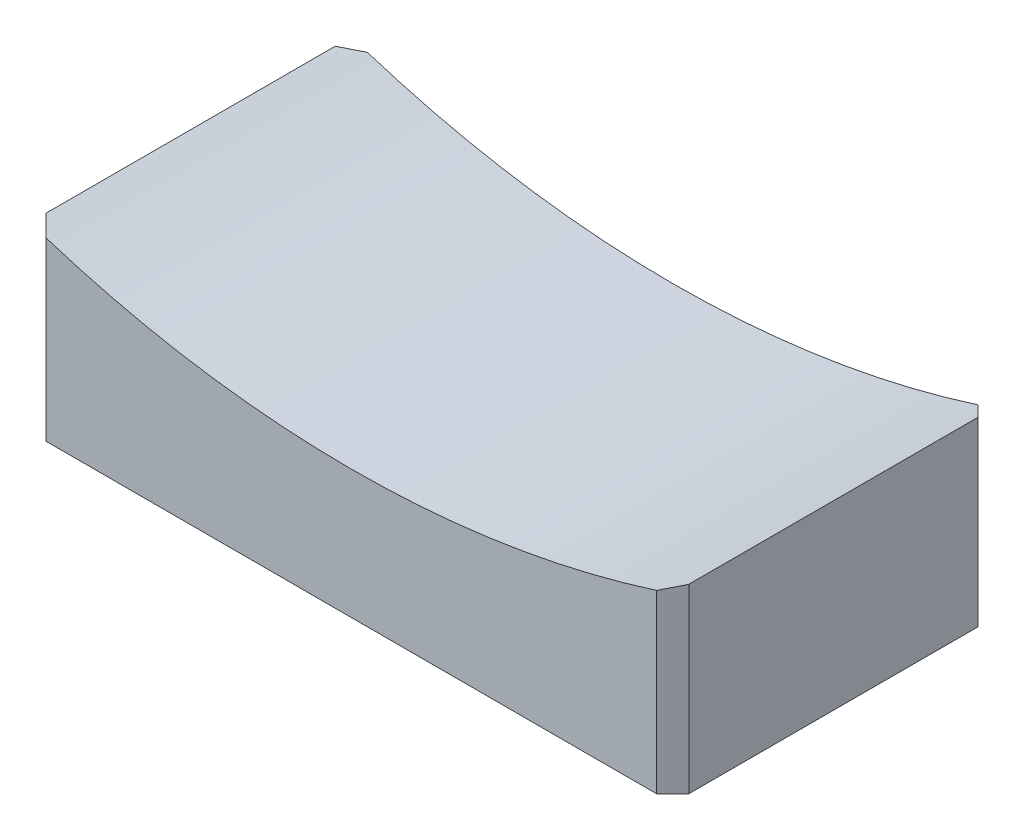
ISO-10303-21;
HEADER;
FILE_DESCRIPTION(('STEP AP214'),'2;1');
FILE_NAME('part.step','',(''),(''),'','','');
FILE_SCHEMA(('AUTOMOTIVE_DESIGN { 1 0 10303 214 1 1 1 1 }'));
ENDSEC;
DATA;
#1=APPLICATION_CONTEXT('core data for automotive mechanical design processes');
#2=APPLICATION_PROTOCOL_DEFINITION('international standard','automotive_design',2000,#1);
#3=PRODUCT_CONTEXT('',#1,'mechanical');
#4=PRODUCT('Part','Part','',(#3));
#5=PRODUCT_RELATED_PRODUCT_CATEGORY('part','',(#4));
#6=PRODUCT_DEFINITION_FORMATION('','',#4);
#7=PRODUCT_DEFINITION_CONTEXT('part definition',#1,'design');
#8=PRODUCT_DEFINITION('design','',#6,#7);
#9=PRODUCT_DEFINITION_SHAPE('','',#8);
#10=(LENGTH_UNIT() NAMED_UNIT(*) SI_UNIT(.MILLI.,.METRE.));
#11=(NAMED_UNIT(*) PLANE_ANGLE_UNIT() SI_UNIT($,.RADIAN.));
#12=(NAMED_UNIT(*) SI_UNIT($,.STERADIAN.) SOLID_ANGLE_UNIT());
#13=UNCERTAINTY_MEASURE_WITH_UNIT(LENGTH_MEASURE(1.E-05),#10,'distance_accuracy_value','');
#14=(GEOMETRIC_REPRESENTATION_CONTEXT(3) GLOBAL_UNCERTAINTY_ASSIGNED_CONTEXT((#13)) GLOBAL_UNIT_ASSIGNED_CONTEXT((#10,
#11,#12)) REPRESENTATION_CONTEXT('',''));
#15=CARTESIAN_POINT('',(0.,0.,0.));
#16=DIRECTION('',(0.,0.,1.));
#17=DIRECTION('',(1.,0.,0.));
#18=AXIS2_PLACEMENT_3D('',#15,#16,#17);
#19=CARTESIAN_POINT('',(0.,44.704,12.7));
#20=DIRECTION('',(0.,0.,-1.));
#21=DIRECTION('',(-1.,0.,0.));
#22=AXIS2_PLACEMENT_3D('',#19,#20,#21);
#23=CYLINDRICAL_SURFACE('',#22,39.624);
#24=CARTESIAN_POINT('',(0.,44.704,0.));
#25=DIRECTION('',(0.,0.,-1.));
#26=DIRECTION('',(-1.,0.,0.));
#27=AXIS2_PLACEMENT_3D('',#24,#25,#26);
#28=CIRCLE('',#27,39.624);
#29=CARTESIAN_POINT('',(12.065,6.96148880903658,0.));
#30=VERTEX_POINT('',#29);
#31=CARTESIAN_POINT('',(-12.065,6.96148880903657,0.));
#32=VERTEX_POINT('',#31);
#33=EDGE_CURVE('E204',#30,#32,#28,.T.);
#34=ORIENTED_EDGE('',*,*,#33,.T.);
#35=CARTESIAN_POINT('',(0.,44.704,-12.0649999999999));
#36=DIRECTION('',(-0.707106781186544,0.,-0.707106781186551));
#37=DIRECTION('',(0.707106781186551,0.,-0.707106781186544));
#38=AXIS2_PLACEMENT_3D('',#35,#36,#37);
#39=ELLIPSE('',#38,56.0367981954713,39.624);
#40=CARTESIAN_POINT('',(-12.7,7.17039670908214,0.635));
#41=VERTEX_POINT('',#40);
#42=EDGE_CURVE('E170',#32,#41,#39,.T.);
#43=ORIENTED_EDGE('',*,*,#42,.T.);
#44=DIRECTION('',(0.,0.,-1.));
#45=VECTOR('',#44,1.);
#46=CARTESIAN_POINT('',(-12.7,7.17039670908214,12.7));
#47=LINE('',#46,#45);
#48=CARTESIAN_POINT('',(-12.7,7.17039670908214,12.065));
#49=VERTEX_POINT('',#48);
#50=EDGE_CURVE('E138',#49,#41,#47,.T.);
#51=ORIENTED_EDGE('',*,*,#50,.F.);
#52=CARTESIAN_POINT('',(0.,44.704,24.765));
#53=DIRECTION('',(0.707106781186546,0.,-0.707106781186549));
#54=DIRECTION('',(-0.707106781186549,0.,-0.707106781186546));
#55=AXIS2_PLACEMENT_3D('',#52,#53,#54);
#56=ELLIPSE('',#55,56.0367981954714,39.624);
#57=CARTESIAN_POINT('',(-12.065,6.96148880903657,12.7));
#58=VERTEX_POINT('',#57);
#59=EDGE_CURVE('E143',#49,#58,#56,.F.);
#60=ORIENTED_EDGE('',*,*,#59,.T.);
#61=CARTESIAN_POINT('',(0.,44.704,12.7));
#62=DIRECTION('',(0.,0.,-1.));
#63=DIRECTION('',(-1.,0.,0.));
#64=AXIS2_PLACEMENT_3D('',#61,#62,#63);
#65=CIRCLE('',#64,39.624);
#66=CARTESIAN_POINT('',(12.065,6.96148880903658,12.7));
#67=VERTEX_POINT('',#66);
#68=EDGE_CURVE('E196',#67,#58,#65,.T.);
#69=ORIENTED_EDGE('',*,*,#68,.F.);
#70=CARTESIAN_POINT('',(0.,44.704,24.765));
#71=DIRECTION('',(-0.707106781186547,0.,-0.707106781186548));
#72=DIRECTION('',(0.707106781186548,0.,-0.707106781186547));
#73=AXIS2_PLACEMENT_3D('',#70,#71,#72);
#74=ELLIPSE('',#73,56.0367981954715,39.624);
#75=CARTESIAN_POINT('',(12.7,7.17039670908215,12.065));
#76=VERTEX_POINT('',#75);
#77=EDGE_CURVE('E71',#67,#76,#74,.F.);
#78=ORIENTED_EDGE('',*,*,#77,.T.);
#79=DIRECTION('',(0.,0.,-1.));
#80=VECTOR('',#79,1.);
#81=CARTESIAN_POINT('',(12.7,7.17039670908215,12.7));
#82=LINE('',#81,#80);
#83=CARTESIAN_POINT('',(12.7,7.17039670908215,0.635000000000004));
#84=VERTEX_POINT('',#83);
#85=EDGE_CURVE('E185',#76,#84,#82,.T.);
#86=ORIENTED_EDGE('',*,*,#85,.T.);
#87=CARTESIAN_POINT('',(0.,44.704,-12.0649999999999));
#88=DIRECTION('',(0.707106781186545,0.,-0.70710678118655));
#89=DIRECTION('',(-0.70710678118655,0.,-0.707106781186545));
#90=AXIS2_PLACEMENT_3D('',#87,#88,#89);
#91=ELLIPSE('',#90,56.0367981954713,39.624);
#92=EDGE_CURVE('E64',#84,#30,#91,.T.);
#93=ORIENTED_EDGE('',*,*,#92,.T.);
#94=EDGE_LOOP('',(#34,#43,#51,#60,#69,#78,#86,#93));
#95=FACE_BOUND('',#94,.T.);
#96=ADVANCED_FACE('F47',(#95),#23,.F.);
#97=CARTESIAN_POINT('',(-12.7,7.17039670908214,12.7));
#98=DIRECTION('',(1.,0.,0.));
#99=DIRECTION('',(0.,1.,0.));
#100=AXIS2_PLACEMENT_3D('',#97,#98,#99);
#101=PLANE('',#100);
#102=ORIENTED_EDGE('',*,*,#50,.T.);
#103=DIRECTION('',(0.,-1.,0.));
#104=VECTOR('',#103,1.);
#105=CARTESIAN_POINT('',(-12.7,0.,0.635));
#106=LINE('',#105,#104);
#107=CARTESIAN_POINT('',(-12.7,0.,0.635));
#108=VERTEX_POINT('',#107);
#109=EDGE_CURVE('E136',#41,#108,#106,.T.);
#110=ORIENTED_EDGE('',*,*,#109,.T.);
#111=DIRECTION('',(0.,0.,-1.));
#112=VECTOR('',#111,1.);
#113=CARTESIAN_POINT('',(-12.7,0.,12.7));
#114=LINE('',#113,#112);
#115=CARTESIAN_POINT('',(-12.7,0.,12.065));
#116=VERTEX_POINT('',#115);
#117=EDGE_CURVE('E118',#116,#108,#114,.T.);
#118=ORIENTED_EDGE('',*,*,#117,.F.);
#119=DIRECTION('',(0.,1.,0.));
#120=VECTOR('',#119,1.);
#121=CARTESIAN_POINT('',(-12.7,7.17039670908214,12.065));
#122=LINE('',#121,#120);
#123=EDGE_CURVE('E133',#116,#49,#122,.T.);
#124=ORIENTED_EDGE('',*,*,#123,.T.);
#125=EDGE_LOOP('',(#102,#110,#118,#124));
#126=FACE_BOUND('',#125,.T.);
#127=ADVANCED_FACE('F132',(#126),#101,.F.);
#128=CARTESIAN_POINT('',(-12.7,0.,12.7));
#129=DIRECTION('',(0.,1.,0.));
#130=DIRECTION('',(-1.,0.,0.));
#131=AXIS2_PLACEMENT_3D('',#128,#129,#130);
#132=PLANE('',#131);
#133=ORIENTED_EDGE('',*,*,#117,.T.);
#134=DIRECTION('',(0.707106781186551,0.,-0.707106781186544));
#135=VECTOR('',#134,1.);
#136=CARTESIAN_POINT('',(-12.7,0.,0.635));
#137=LINE('',#136,#135);
#138=CARTESIAN_POINT('',(-12.065,0.,0.));
#139=VERTEX_POINT('',#138);
#140=EDGE_CURVE('E126',#108,#139,#137,.T.);
#141=ORIENTED_EDGE('',*,*,#140,.T.);
#142=DIRECTION('',(1.,0.,0.));
#143=VECTOR('',#142,1.);
#144=CARTESIAN_POINT('',(-12.7,0.,0.));
#145=LINE('',#144,#143);
#146=CARTESIAN_POINT('',(12.065,0.,0.));
#147=VERTEX_POINT('',#146);
#148=EDGE_CURVE('E199',#139,#147,#145,.T.);
#149=ORIENTED_EDGE('',*,*,#148,.T.);
#150=DIRECTION('',(0.70710678118655,0.,0.707106781186545));
#151=VECTOR('',#150,1.);
#152=CARTESIAN_POINT('',(12.7,0.,0.635000000000004));
#153=LINE('',#152,#151);
#154=CARTESIAN_POINT('',(12.7,0.,0.635000000000004));
#155=VERTEX_POINT('',#154);
#156=EDGE_CURVE('E127',#147,#155,#153,.T.);
#157=ORIENTED_EDGE('',*,*,#156,.T.);
#158=DIRECTION('',(0.,0.,-1.));
#159=VECTOR('',#158,1.);
#160=CARTESIAN_POINT('',(12.7,0.,12.7));
#161=LINE('',#160,#159);
#162=CARTESIAN_POINT('',(12.7,0.,12.065));
#163=VERTEX_POINT('',#162);
#164=EDGE_CURVE('E139',#163,#155,#161,.T.);
#165=ORIENTED_EDGE('',*,*,#164,.F.);
#166=DIRECTION('',(0.707106781186548,0.,-0.707106781186547));
#167=VECTOR('',#166,1.);
#168=CARTESIAN_POINT('',(12.065,0.,12.7));
#169=LINE('',#168,#167);
#170=CARTESIAN_POINT('',(12.065,0.,12.7));
#171=VERTEX_POINT('',#170);
#172=EDGE_CURVE('E148',#163,#171,#169,.F.);
#173=ORIENTED_EDGE('',*,*,#172,.T.);
#174=DIRECTION('',(1.,0.,0.));
#175=VECTOR('',#174,1.);
#176=CARTESIAN_POINT('',(-12.7,0.,12.7));
#177=LINE('',#176,#175);
#178=CARTESIAN_POINT('',(-12.065,0.,12.7));
#179=VERTEX_POINT('',#178);
#180=EDGE_CURVE('E120',#179,#171,#177,.T.);
#181=ORIENTED_EDGE('',*,*,#180,.F.);
#182=DIRECTION('',(0.707106781186549,0.,0.707106781186546));
#183=VECTOR('',#182,1.);
#184=CARTESIAN_POINT('',(-12.065,0.,12.7));
#185=LINE('',#184,#183);
#186=EDGE_CURVE('E115',#179,#116,#185,.F.);
#187=ORIENTED_EDGE('',*,*,#186,.T.);
#188=EDGE_LOOP('',(#133,#141,#149,#157,#165,#173,#181,#187));
#189=FACE_BOUND('',#188,.T.);
#190=ADVANCED_FACE('F117',(#189),#132,.F.);
#191=CARTESIAN_POINT('',(12.7,0.,12.7));
#192=DIRECTION('',(-1.,0.,0.));
#193=DIRECTION('',(0.,-1.,0.));
#194=AXIS2_PLACEMENT_3D('',#191,#192,#193);
#195=PLANE('',#194);
#196=ORIENTED_EDGE('',*,*,#164,.T.);
#197=DIRECTION('',(0.,1.,0.));
#198=VECTOR('',#197,1.);
#199=CARTESIAN_POINT('',(12.7,7.17039670908215,0.635000000000004));
#200=LINE('',#199,#198);
#201=EDGE_CURVE('E11',#155,#84,#200,.T.);
#202=ORIENTED_EDGE('',*,*,#201,.T.);
#203=ORIENTED_EDGE('',*,*,#85,.F.);
#204=DIRECTION('',(0.,-1.,0.));
#205=VECTOR('',#204,1.);
#206=CARTESIAN_POINT('',(12.7,0.,12.065));
#207=LINE('',#206,#205);
#208=EDGE_CURVE('E57',#76,#163,#207,.T.);
#209=ORIENTED_EDGE('',*,*,#208,.T.);
#210=EDGE_LOOP('',(#196,#202,#203,#209));
#211=FACE_BOUND('',#210,.T.);
#212=ADVANCED_FACE('F184',(#211),#195,.F.);
#213=CARTESIAN_POINT('',(0.,44.704,12.7));
#214=DIRECTION('',(0.,0.,-1.));
#215=DIRECTION('',(-1.,0.,0.));
#216=AXIS2_PLACEMENT_3D('',#213,#214,#215);
#217=PLANE('',#216);
#218=ORIENTED_EDGE('',*,*,#68,.T.);
#219=DIRECTION('',(0.,-1.,0.));
#220=VECTOR('',#219,1.);
#221=CARTESIAN_POINT('',(-12.065,44.704,12.7));
#222=LINE('',#221,#220);
#223=EDGE_CURVE('E177',#58,#179,#222,.T.);
#224=ORIENTED_EDGE('',*,*,#223,.T.);
#225=ORIENTED_EDGE('',*,*,#180,.T.);
#226=DIRECTION('',(0.,1.,0.));
#227=VECTOR('',#226,1.);
#228=CARTESIAN_POINT('',(12.065,44.704,12.7));
#229=LINE('',#228,#227);
#230=EDGE_CURVE('E173',#171,#67,#229,.T.);
#231=ORIENTED_EDGE('',*,*,#230,.T.);
#232=EDGE_LOOP('',(#218,#224,#225,#231));
#233=FACE_BOUND('',#232,.T.);
#234=ADVANCED_FACE('F195',(#233),#217,.F.);
#235=CARTESIAN_POINT('',(0.,44.704,0.));
#236=DIRECTION('',(0.,0.,-1.));
#237=DIRECTION('',(-1.,0.,0.));
#238=AXIS2_PLACEMENT_3D('',#235,#236,#237);
#239=PLANE('',#238);
#240=ORIENTED_EDGE('',*,*,#148,.F.);
#241=DIRECTION('',(0.,1.,0.));
#242=VECTOR('',#241,1.);
#243=CARTESIAN_POINT('',(-12.065,7.17039670908214,0.));
#244=LINE('',#243,#242);
#245=EDGE_CURVE('E161',#139,#32,#244,.T.);
#246=ORIENTED_EDGE('',*,*,#245,.T.);
#247=ORIENTED_EDGE('',*,*,#33,.F.);
#248=DIRECTION('',(0.,-1.,0.));
#249=VECTOR('',#248,1.);
#250=CARTESIAN_POINT('',(12.065,0.,0.));
#251=LINE('',#250,#249);
#252=EDGE_CURVE('E158',#30,#147,#251,.T.);
#253=ORIENTED_EDGE('',*,*,#252,.T.);
#254=EDGE_LOOP('',(#240,#246,#247,#253));
#255=FACE_BOUND('',#254,.T.);
#256=ADVANCED_FACE('F214',(#255),#239,.T.);
#257=CARTESIAN_POINT('',(-12.7,7.17039670908214,0.635));
#258=DIRECTION('',(-0.707106781186544,0.,-0.707106781186551));
#259=DIRECTION('',(0.,1.,0.));
#260=AXIS2_PLACEMENT_3D('',#257,#258,#259);
#261=PLANE('',#260);
#262=ORIENTED_EDGE('',*,*,#42,.F.);
#263=ORIENTED_EDGE('',*,*,#245,.F.);
#264=ORIENTED_EDGE('',*,*,#140,.F.);
#265=ORIENTED_EDGE('',*,*,#109,.F.);
#266=EDGE_LOOP('',(#262,#263,#264,#265));
#267=FACE_BOUND('',#266,.T.);
#268=ADVANCED_FACE('F222',(#267),#261,.T.);
#269=CARTESIAN_POINT('',(-12.065,44.704,12.7));
#270=DIRECTION('',(0.707106781186546,0.,-0.707106781186549));
#271=DIRECTION('',(0.,-1.,0.));
#272=AXIS2_PLACEMENT_3D('',#269,#270,#271);
#273=PLANE('',#272);
#274=ORIENTED_EDGE('',*,*,#59,.F.);
#275=ORIENTED_EDGE('',*,*,#123,.F.);
#276=ORIENTED_EDGE('',*,*,#186,.F.);
#277=ORIENTED_EDGE('',*,*,#223,.F.);
#278=EDGE_LOOP('',(#274,#275,#276,#277));
#279=FACE_BOUND('',#278,.T.);
#280=ADVANCED_FACE('F142',(#279),#273,.F.);
#281=CARTESIAN_POINT('',(12.7,0.,0.635000000000004));
#282=DIRECTION('',(0.707106781186545,0.,-0.70710678118655));
#283=DIRECTION('',(0.,-1.,0.));
#284=AXIS2_PLACEMENT_3D('',#281,#282,#283);
#285=PLANE('',#284);
#286=ORIENTED_EDGE('',*,*,#156,.F.);
#287=ORIENTED_EDGE('',*,*,#252,.F.);
#288=ORIENTED_EDGE('',*,*,#92,.F.);
#289=ORIENTED_EDGE('',*,*,#201,.F.);
#290=EDGE_LOOP('',(#286,#287,#288,#289));
#291=FACE_BOUND('',#290,.T.);
#292=ADVANCED_FACE('F216',(#291),#285,.T.);
#293=CARTESIAN_POINT('',(12.065,44.704,12.7));
#294=DIRECTION('',(-0.707106781186547,0.,-0.707106781186548));
#295=DIRECTION('',(0.,1.,0.));
#296=AXIS2_PLACEMENT_3D('',#293,#294,#295);
#297=PLANE('',#296);
#298=ORIENTED_EDGE('',*,*,#172,.F.);
#299=ORIENTED_EDGE('',*,*,#208,.F.);
#300=ORIENTED_EDGE('',*,*,#77,.F.);
#301=ORIENTED_EDGE('',*,*,#230,.F.);
#302=EDGE_LOOP('',(#298,#299,#300,#301));
#303=FACE_BOUND('',#302,.T.);
#304=ADVANCED_FACE('F50',(#303),#297,.F.);
#305=CLOSED_SHELL('',(#96,#127,#190,#212,#234,#256,#268,#280,#292,#304));
#306=MANIFOLD_SOLID_BREP('B2',#305);
#307=ADVANCED_BREP_SHAPE_REPRESENTATION('',(#18,#306),#14);
#308=SHAPE_DEFINITION_REPRESENTATION(#9,#307);
ENDSEC;
END-ISO-10303-21;
